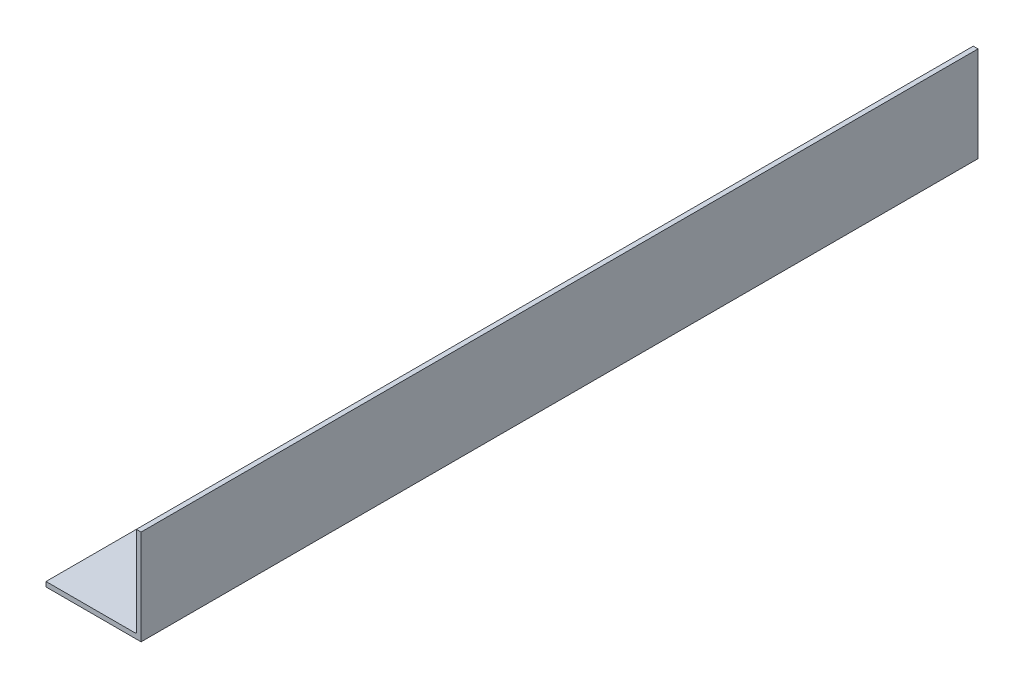
ISO-10303-21;
HEADER;
FILE_DESCRIPTION(('STEP AP214'),'2;1');
FILE_NAME('part.step','',(''),(''),'','','');
FILE_SCHEMA(('AUTOMOTIVE_DESIGN { 1 0 10303 214 1 1 1 1 }'));
ENDSEC;
DATA;
#1=APPLICATION_CONTEXT('core data for automotive mechanical design processes');
#2=APPLICATION_PROTOCOL_DEFINITION('international standard','automotive_design',2000,#1);
#3=PRODUCT_CONTEXT('',#1,'mechanical');
#4=PRODUCT('Part','Part','',(#3));
#5=PRODUCT_RELATED_PRODUCT_CATEGORY('part','',(#4));
#6=PRODUCT_DEFINITION_FORMATION('','',#4);
#7=PRODUCT_DEFINITION_CONTEXT('part definition',#1,'design');
#8=PRODUCT_DEFINITION('design','',#6,#7);
#9=PRODUCT_DEFINITION_SHAPE('','',#8);
#10=(LENGTH_UNIT() NAMED_UNIT(*) SI_UNIT(.MILLI.,.METRE.));
#11=(NAMED_UNIT(*) PLANE_ANGLE_UNIT() SI_UNIT($,.RADIAN.));
#12=(NAMED_UNIT(*) SI_UNIT($,.STERADIAN.) SOLID_ANGLE_UNIT());
#13=UNCERTAINTY_MEASURE_WITH_UNIT(LENGTH_MEASURE(1.E-05),#10,'distance_accuracy_value','');
#14=(GEOMETRIC_REPRESENTATION_CONTEXT(3) GLOBAL_UNCERTAINTY_ASSIGNED_CONTEXT((#13)) GLOBAL_UNIT_ASSIGNED_CONTEXT((#10,
#11,#12)) REPRESENTATION_CONTEXT('',''));
#15=CARTESIAN_POINT('',(0.,0.,0.));
#16=DIRECTION('',(0.,0.,1.));
#17=DIRECTION('',(1.,0.,0.));
#18=AXIS2_PLACEMENT_3D('',#15,#16,#17);
#19=CARTESIAN_POINT('',(-15.875,0.,139.7));
#20=DIRECTION('',(1.,0.,0.));
#21=DIRECTION('',(0.,0.,-1.));
#22=AXIS2_PLACEMENT_3D('',#19,#20,#21);
#23=PLANE('',#22);
#24=DIRECTION('',(0.,-1.,0.));
#25=VECTOR('',#24,1.);
#26=CARTESIAN_POINT('',(-15.875,0.,-139.7));
#27=LINE('',#26,#25);
#28=CARTESIAN_POINT('',(-15.875,1.5875,-139.7));
#29=VERTEX_POINT('',#28);
#30=CARTESIAN_POINT('',(-15.875,0.,-139.7));
#31=VERTEX_POINT('',#30);
#32=EDGE_CURVE('E134',#29,#31,#27,.T.);
#33=ORIENTED_EDGE('',*,*,#32,.T.);
#34=DIRECTION('',(0.,0.,-1.));
#35=VECTOR('',#34,1.);
#36=CARTESIAN_POINT('',(-15.875,0.,139.7));
#37=LINE('',#36,#35);
#38=CARTESIAN_POINT('',(-15.875,0.,139.7));
#39=VERTEX_POINT('',#38);
#40=EDGE_CURVE('E11',#39,#31,#37,.T.);
#41=ORIENTED_EDGE('',*,*,#40,.F.);
#42=DIRECTION('',(0.,-1.,0.));
#43=VECTOR('',#42,1.);
#44=CARTESIAN_POINT('',(-15.875,0.,139.7));
#45=LINE('',#44,#43);
#46=CARTESIAN_POINT('',(-15.875,1.5875,139.7));
#47=VERTEX_POINT('',#46);
#48=EDGE_CURVE('E153',#47,#39,#45,.T.);
#49=ORIENTED_EDGE('',*,*,#48,.F.);
#50=DIRECTION('',(0.,0.,-1.));
#51=VECTOR('',#50,1.);
#52=CARTESIAN_POINT('',(-15.875,1.5875,139.7));
#53=LINE('',#52,#51);
#54=EDGE_CURVE('E130',#47,#29,#53,.T.);
#55=ORIENTED_EDGE('',*,*,#54,.T.);
#56=EDGE_LOOP('',(#33,#41,#49,#55));
#57=FACE_BOUND('',#56,.T.);
#58=ADVANCED_FACE('F39',(#57),#23,.F.);
#59=CARTESIAN_POINT('',(-15.875,0.,139.7));
#60=DIRECTION('',(0.,1.,0.));
#61=DIRECTION('',(0.,0.,1.));
#62=AXIS2_PLACEMENT_3D('',#59,#60,#61);
#63=PLANE('',#62);
#64=DIRECTION('',(1.,0.,0.));
#65=VECTOR('',#64,1.);
#66=CARTESIAN_POINT('',(-15.875,0.,-139.7));
#67=LINE('',#66,#65);
#68=CARTESIAN_POINT('',(15.875,0.,-139.7));
#69=VERTEX_POINT('',#68);
#70=EDGE_CURVE('E138',#31,#69,#67,.T.);
#71=ORIENTED_EDGE('',*,*,#70,.T.);
#72=DIRECTION('',(0.,0.,-1.));
#73=VECTOR('',#72,1.);
#74=CARTESIAN_POINT('',(15.875,0.,139.7));
#75=LINE('',#74,#73);
#76=CARTESIAN_POINT('',(15.875,0.,139.7));
#77=VERTEX_POINT('',#76);
#78=EDGE_CURVE('E48',#77,#69,#75,.T.);
#79=ORIENTED_EDGE('',*,*,#78,.F.);
#80=DIRECTION('',(1.,0.,0.));
#81=VECTOR('',#80,1.);
#82=CARTESIAN_POINT('',(-15.875,0.,139.7));
#83=LINE('',#82,#81);
#84=EDGE_CURVE('E96',#39,#77,#83,.T.);
#85=ORIENTED_EDGE('',*,*,#84,.F.);
#86=ORIENTED_EDGE('',*,*,#40,.T.);
#87=EDGE_LOOP('',(#71,#79,#85,#86));
#88=FACE_BOUND('',#87,.T.);
#89=ADVANCED_FACE('F187',(#88),#63,.F.);
#90=CARTESIAN_POINT('',(15.875,0.,139.7));
#91=DIRECTION('',(-1.,0.,0.));
#92=DIRECTION('',(0.,0.,1.));
#93=AXIS2_PLACEMENT_3D('',#90,#91,#92);
#94=PLANE('',#93);
#95=DIRECTION('',(0.,1.,0.));
#96=VECTOR('',#95,1.);
#97=CARTESIAN_POINT('',(15.875,0.,-139.7));
#98=LINE('',#97,#96);
#99=CARTESIAN_POINT('',(15.875,31.75,-139.7));
#100=VERTEX_POINT('',#99);
#101=EDGE_CURVE('E141',#69,#100,#98,.T.);
#102=ORIENTED_EDGE('',*,*,#101,.T.);
#103=DIRECTION('',(0.,0.,-1.));
#104=VECTOR('',#103,1.);
#105=CARTESIAN_POINT('',(15.875,31.75,139.7));
#106=LINE('',#105,#104);
#107=CARTESIAN_POINT('',(15.875,31.75,139.7));
#108=VERTEX_POINT('',#107);
#109=EDGE_CURVE('E160',#108,#100,#106,.T.);
#110=ORIENTED_EDGE('',*,*,#109,.F.);
#111=DIRECTION('',(0.,1.,0.));
#112=VECTOR('',#111,1.);
#113=CARTESIAN_POINT('',(15.875,0.,139.7));
#114=LINE('',#113,#112);
#115=EDGE_CURVE('E170',#77,#108,#114,.T.);
#116=ORIENTED_EDGE('',*,*,#115,.F.);
#117=ORIENTED_EDGE('',*,*,#78,.T.);
#118=EDGE_LOOP('',(#102,#110,#116,#117));
#119=FACE_BOUND('',#118,.T.);
#120=ADVANCED_FACE('F168',(#119),#94,.F.);
#121=CARTESIAN_POINT('',(15.875,31.75,139.7));
#122=DIRECTION('',(0.,-1.,0.));
#123=DIRECTION('',(0.,0.,-1.));
#124=AXIS2_PLACEMENT_3D('',#121,#122,#123);
#125=PLANE('',#124);
#126=DIRECTION('',(-1.,0.,0.));
#127=VECTOR('',#126,1.);
#128=CARTESIAN_POINT('',(15.875,31.75,-139.7));
#129=LINE('',#128,#127);
#130=CARTESIAN_POINT('',(14.2875,31.75,-139.7));
#131=VERTEX_POINT('',#130);
#132=EDGE_CURVE('E144',#100,#131,#129,.T.);
#133=ORIENTED_EDGE('',*,*,#132,.T.);
#134=DIRECTION('',(0.,0.,-1.));
#135=VECTOR('',#134,1.);
#136=CARTESIAN_POINT('',(14.2875,31.75,139.7));
#137=LINE('',#136,#135);
#138=CARTESIAN_POINT('',(14.2875,31.75,139.7));
#139=VERTEX_POINT('',#138);
#140=EDGE_CURVE('E123',#139,#131,#137,.T.);
#141=ORIENTED_EDGE('',*,*,#140,.F.);
#142=DIRECTION('',(-1.,0.,0.));
#143=VECTOR('',#142,1.);
#144=CARTESIAN_POINT('',(15.875,31.75,139.7));
#145=LINE('',#144,#143);
#146=EDGE_CURVE('E112',#108,#139,#145,.T.);
#147=ORIENTED_EDGE('',*,*,#146,.F.);
#148=ORIENTED_EDGE('',*,*,#109,.T.);
#149=EDGE_LOOP('',(#133,#141,#147,#148));
#150=FACE_BOUND('',#149,.T.);
#151=ADVANCED_FACE('F176',(#150),#125,.F.);
#152=CARTESIAN_POINT('',(14.2875,31.75,139.7));
#153=DIRECTION('',(1.,0.,0.));
#154=DIRECTION('',(0.,1.,0.));
#155=AXIS2_PLACEMENT_3D('',#152,#153,#154);
#156=PLANE('',#155);
#157=DIRECTION('',(0.,-1.,0.));
#158=VECTOR('',#157,1.);
#159=CARTESIAN_POINT('',(14.2875,31.75,-139.7));
#160=LINE('',#159,#158);
#161=CARTESIAN_POINT('',(14.2875,1.9685,-139.7));
#162=VERTEX_POINT('',#161);
#163=EDGE_CURVE('E121',#131,#162,#160,.T.);
#164=ORIENTED_EDGE('',*,*,#163,.T.);
#165=DIRECTION('',(0.,0.,-1.));
#166=VECTOR('',#165,1.);
#167=CARTESIAN_POINT('',(14.2875,1.9685,139.7));
#168=LINE('',#167,#166);
#169=CARTESIAN_POINT('',(14.2875,1.9685,139.7));
#170=VERTEX_POINT('',#169);
#171=EDGE_CURVE('E118',#170,#162,#168,.T.);
#172=ORIENTED_EDGE('',*,*,#171,.F.);
#173=DIRECTION('',(0.,-1.,0.));
#174=VECTOR('',#173,1.);
#175=CARTESIAN_POINT('',(14.2875,31.75,139.7));
#176=LINE('',#175,#174);
#177=EDGE_CURVE('E106',#139,#170,#176,.T.);
#178=ORIENTED_EDGE('',*,*,#177,.F.);
#179=ORIENTED_EDGE('',*,*,#140,.T.);
#180=EDGE_LOOP('',(#164,#172,#178,#179));
#181=FACE_BOUND('',#180,.T.);
#182=ADVANCED_FACE('F119',(#181),#156,.F.);
#183=CARTESIAN_POINT('',(13.9065,1.9685,139.7));
#184=DIRECTION('',(0.,0.,-1.));
#185=DIRECTION('',(-1.,0.,0.));
#186=AXIS2_PLACEMENT_3D('',#183,#184,#185);
#187=CYLINDRICAL_SURFACE('',#186,0.381000000000001);
#188=CARTESIAN_POINT('',(13.9065,1.9685,-139.7));
#189=DIRECTION('',(0.,0.,-1.));
#190=DIRECTION('',(1.,0.,0.));
#191=AXIS2_PLACEMENT_3D('',#188,#189,#190);
#192=CIRCLE('',#191,0.381000000000001);
#193=CARTESIAN_POINT('',(13.9065,1.5875,-139.7));
#194=VERTEX_POINT('',#193);
#195=EDGE_CURVE('E82',#162,#194,#192,.T.);
#196=ORIENTED_EDGE('',*,*,#195,.T.);
#197=DIRECTION('',(0.,0.,-1.));
#198=VECTOR('',#197,1.);
#199=CARTESIAN_POINT('',(13.9065,1.5875,139.7));
#200=LINE('',#199,#198);
#201=CARTESIAN_POINT('',(13.9065,1.5875,139.7));
#202=VERTEX_POINT('',#201);
#203=EDGE_CURVE('E124',#202,#194,#200,.T.);
#204=ORIENTED_EDGE('',*,*,#203,.F.);
#205=CARTESIAN_POINT('',(13.9065,1.9685,139.7));
#206=DIRECTION('',(0.,0.,-1.));
#207=DIRECTION('',(1.,0.,0.));
#208=AXIS2_PLACEMENT_3D('',#205,#206,#207);
#209=CIRCLE('',#208,0.381000000000001);
#210=EDGE_CURVE('E110',#170,#202,#209,.T.);
#211=ORIENTED_EDGE('',*,*,#210,.F.);
#212=ORIENTED_EDGE('',*,*,#171,.T.);
#213=EDGE_LOOP('',(#196,#204,#211,#212));
#214=FACE_BOUND('',#213,.T.);
#215=ADVANCED_FACE('F126',(#214),#187,.F.);
#216=CARTESIAN_POINT('',(13.9065,1.5875,139.7));
#217=DIRECTION('',(0.,-1.,0.));
#218=DIRECTION('',(1.,0.,0.));
#219=AXIS2_PLACEMENT_3D('',#216,#217,#218);
#220=PLANE('',#219);
#221=DIRECTION('',(-1.,0.,0.));
#222=VECTOR('',#221,1.);
#223=CARTESIAN_POINT('',(13.9065,1.5875,-139.7));
#224=LINE('',#223,#222);
#225=EDGE_CURVE('E88',#194,#29,#224,.T.);
#226=ORIENTED_EDGE('',*,*,#225,.T.);
#227=ORIENTED_EDGE('',*,*,#54,.F.);
#228=DIRECTION('',(-1.,0.,0.));
#229=VECTOR('',#228,1.);
#230=CARTESIAN_POINT('',(13.9065,1.5875,139.7));
#231=LINE('',#230,#229);
#232=EDGE_CURVE('E56',#202,#47,#231,.T.);
#233=ORIENTED_EDGE('',*,*,#232,.F.);
#234=ORIENTED_EDGE('',*,*,#203,.T.);
#235=EDGE_LOOP('',(#226,#227,#233,#234));
#236=FACE_BOUND('',#235,.T.);
#237=ADVANCED_FACE('F201',(#236),#220,.F.);
#238=CARTESIAN_POINT('',(13.9065,1.9685,139.7));
#239=DIRECTION('',(0.,0.,1.));
#240=DIRECTION('',(1.,0.,0.));
#241=AXIS2_PLACEMENT_3D('',#238,#239,#240);
#242=PLANE('',#241);
#243=ORIENTED_EDGE('',*,*,#48,.T.);
#244=ORIENTED_EDGE('',*,*,#84,.T.);
#245=ORIENTED_EDGE('',*,*,#115,.T.);
#246=ORIENTED_EDGE('',*,*,#146,.T.);
#247=ORIENTED_EDGE('',*,*,#177,.T.);
#248=ORIENTED_EDGE('',*,*,#210,.T.);
#249=ORIENTED_EDGE('',*,*,#232,.T.);
#250=EDGE_LOOP('',(#243,#244,#245,#246,#247,#248,#249));
#251=FACE_BOUND('',#250,.T.);
#252=ADVANCED_FACE('F108',(#251),#242,.T.);
#253=CARTESIAN_POINT('',(13.9065,1.9685,-139.7));
#254=DIRECTION('',(0.,0.,1.));
#255=DIRECTION('',(1.,0.,0.));
#256=AXIS2_PLACEMENT_3D('',#253,#254,#255);
#257=PLANE('',#256);
#258=ORIENTED_EDGE('',*,*,#32,.F.);
#259=ORIENTED_EDGE('',*,*,#225,.F.);
#260=ORIENTED_EDGE('',*,*,#195,.F.);
#261=ORIENTED_EDGE('',*,*,#163,.F.);
#262=ORIENTED_EDGE('',*,*,#132,.F.);
#263=ORIENTED_EDGE('',*,*,#101,.F.);
#264=ORIENTED_EDGE('',*,*,#70,.F.);
#265=EDGE_LOOP('',(#258,#259,#260,#261,#262,#263,#264));
#266=FACE_BOUND('',#265,.T.);
#267=ADVANCED_FACE('F174',(#266),#257,.F.);
#268=CLOSED_SHELL('',(#58,#89,#120,#151,#182,#215,#237,#252,#267));
#269=MANIFOLD_SOLID_BREP('B2',#268);
#270=ADVANCED_BREP_SHAPE_REPRESENTATION('',(#18,#269),#14);
#271=SHAPE_DEFINITION_REPRESENTATION(#9,#270);
ENDSEC;
END-ISO-10303-21;
